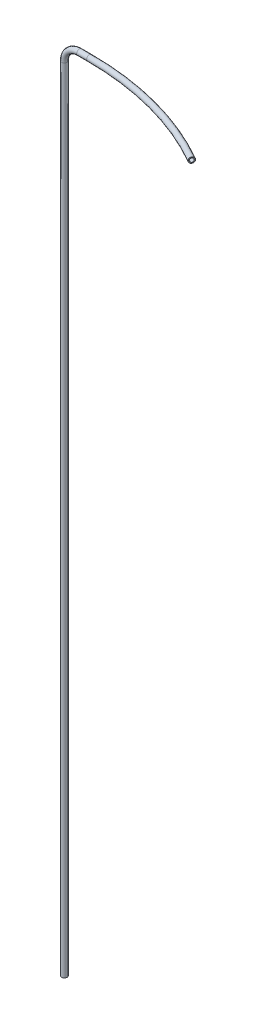
ISO-10303-21;
HEADER;
FILE_DESCRIPTION(('STEP AP214'),'2;1');
FILE_NAME('part.step','',(''),(''),'','','');
FILE_SCHEMA(('AUTOMOTIVE_DESIGN { 1 0 10303 214 1 1 1 1 }'));
ENDSEC;
DATA;
#1=APPLICATION_CONTEXT('core data for automotive mechanical design processes');
#2=APPLICATION_PROTOCOL_DEFINITION('international standard','automotive_design',2000,#1);
#3=PRODUCT_CONTEXT('',#1,'mechanical');
#4=PRODUCT('Part','Part','',(#3));
#5=PRODUCT_RELATED_PRODUCT_CATEGORY('part','',(#4));
#6=PRODUCT_DEFINITION_FORMATION('','',#4);
#7=PRODUCT_DEFINITION_CONTEXT('part definition',#1,'design');
#8=PRODUCT_DEFINITION('design','',#6,#7);
#9=PRODUCT_DEFINITION_SHAPE('','',#8);
#10=(LENGTH_UNIT() NAMED_UNIT(*) SI_UNIT(.MILLI.,.METRE.));
#11=(NAMED_UNIT(*) PLANE_ANGLE_UNIT() SI_UNIT($,.RADIAN.));
#12=(NAMED_UNIT(*) SI_UNIT($,.STERADIAN.) SOLID_ANGLE_UNIT());
#13=UNCERTAINTY_MEASURE_WITH_UNIT(LENGTH_MEASURE(1.E-05),#10,'distance_accuracy_value','');
#14=(GEOMETRIC_REPRESENTATION_CONTEXT(3) GLOBAL_UNCERTAINTY_ASSIGNED_CONTEXT((#13)) GLOBAL_UNIT_ASSIGNED_CONTEXT((#10,
#11,#12)) REPRESENTATION_CONTEXT('',''));
#15=CARTESIAN_POINT('',(0.,0.,0.));
#16=DIRECTION('',(0.,0.,1.));
#17=DIRECTION('',(1.,0.,0.));
#18=AXIS2_PLACEMENT_3D('',#15,#16,#17);
#19=CARTESIAN_POINT('',(0.,-0.371055821718923,-700.));
#20=DIRECTION('',(0.,1.,0.));
#21=DIRECTION('',(0.,0.,1.));
#22=AXIS2_PLACEMENT_3D('',#19,#20,#21);
#23=TOROIDAL_SURFACE('',#22,600.,6.0000000000001);
#24=CARTESIAN_POINT('',(300.000000000001,-0.371055821718923,-1219.61524227066));
#25=DIRECTION('',(0.866025403784438,0.,0.500000000000001));
#26=DIRECTION('',(0.500000000000001,0.,-0.866025403784438));
#27=AXIS2_PLACEMENT_3D('',#24,#25,#26);
#28=CIRCLE('',#27,6.0000000000001);
#29=CARTESIAN_POINT('',(303.000000000001,-0.371055821718923,-1224.81139469337));
#30=VERTEX_POINT('',#29);
#31=EDGE_CURVE('E49',#30,#30,#28,.T.);
#32=CARTESIAN_POINT('',(0.,-0.371055821718923,-1300.));
#33=DIRECTION('',(-1.,0.,0.));
#34=DIRECTION('',(0.,0.,1.));
#35=AXIS2_PLACEMENT_3D('',#32,#33,#34);
#36=CIRCLE('',#35,6.0000000000001);
#37=CARTESIAN_POINT('',(0.,-0.371055821718923,-1306.));
#38=VERTEX_POINT('',#37);
#39=EDGE_CURVE('E66',#38,#38,#36,.T.);
#40=CARTESIAN_POINT('',(0.,-0.371055821718923,-700.));
#41=DIRECTION('',(0.,1.,0.));
#42=DIRECTION('',(0.,0.,1.));
#43=AXIS2_PLACEMENT_3D('',#40,#41,#42);
#44=CIRCLE('',#43,606.);
#45=EDGE_CURVE('',#30,#38,#44,.T.);
#46=ORIENTED_EDGE('',*,*,#31,.F.);
#47=ORIENTED_EDGE('',*,*,#39,.F.);
#48=ORIENTED_EDGE('',*,*,#45,.T.);
#49=ORIENTED_EDGE('',*,*,#45,.F.);
#50=EDGE_LOOP('',(#46,#48,#47,#49));
#51=FACE_BOUND('',#50,.T.);
#52=ADVANCED_FACE('F41',(#51),#23,.T.);
#53=CARTESIAN_POINT('',(0.,-0.371055821718923,-700.));
#54=DIRECTION('',(0.,1.,0.));
#55=DIRECTION('',(0.,0.,1.));
#56=AXIS2_PLACEMENT_3D('',#53,#54,#55);
#57=TOROIDAL_SURFACE('',#56,600.,3.99999999999999);
#58=CARTESIAN_POINT('',(300.000000000001,-0.371055821718923,-1219.61524227066));
#59=DIRECTION('',(0.866025403784438,0.,0.500000000000001));
#60=DIRECTION('',(0.500000000000001,0.,-0.866025403784438));
#61=AXIS2_PLACEMENT_3D('',#58,#59,#60);
#62=CIRCLE('',#61,3.99999999999999);
#63=CARTESIAN_POINT('',(302.000000000001,-0.371055821718923,-1223.0793438858));
#64=VERTEX_POINT('',#63);
#65=EDGE_CURVE('E10',#64,#64,#62,.T.);
#66=CARTESIAN_POINT('',(0.,-0.371055821718923,-1300.));
#67=DIRECTION('',(1.,0.,0.));
#68=DIRECTION('',(0.,0.,-1.));
#69=AXIS2_PLACEMENT_3D('',#66,#67,#68);
#70=CIRCLE('',#69,3.99999999999999);
#71=CARTESIAN_POINT('',(0.,-0.371055821718923,-1304.));
#72=VERTEX_POINT('',#71);
#73=EDGE_CURVE('E54',#72,#72,#70,.T.);
#74=CARTESIAN_POINT('',(0.,-0.371055821718923,-700.));
#75=DIRECTION('',(0.,1.,0.));
#76=DIRECTION('',(0.,0.,1.));
#77=AXIS2_PLACEMENT_3D('',#74,#75,#76);
#78=CIRCLE('',#77,604.);
#79=EDGE_CURVE('',#64,#72,#78,.T.);
#80=ORIENTED_EDGE('',*,*,#65,.T.);
#81=ORIENTED_EDGE('',*,*,#73,.F.);
#82=ORIENTED_EDGE('',*,*,#79,.T.);
#83=ORIENTED_EDGE('',*,*,#79,.F.);
#84=EDGE_LOOP('',(#80,#82,#81,#83));
#85=FACE_BOUND('',#84,.T.);
#86=ADVANCED_FACE('F43',(#85),#57,.F.);
#87=CARTESIAN_POINT('',(-350.000000000001,0.,-93.7822173508934));
#88=DIRECTION('',(0.866025403784438,0.,0.500000000000001));
#89=DIRECTION('',(0.500000000000001,0.,-0.866025403784438));
#90=AXIS2_PLACEMENT_3D('',#87,#88,#89);
#91=PLANE('',#90);
#92=ORIENTED_EDGE('',*,*,#31,.T.);
#93=EDGE_LOOP('',(#92));
#94=FACE_BOUND('',#93,.T.);
#95=ORIENTED_EDGE('',*,*,#65,.F.);
#96=EDGE_LOOP('',(#95));
#97=FACE_BOUND('',#96,.T.);
#98=ADVANCED_FACE('F103',(#94,#97),#91,.T.);
#99=CARTESIAN_POINT('',(0.,-0.371055821718923,-1300.));
#100=DIRECTION('',(-1.,0.,0.));
#101=DIRECTION('',(0.,0.,1.));
#102=AXIS2_PLACEMENT_3D('',#99,#100,#101);
#103=CYLINDRICAL_SURFACE('',#102,6.0000000000001);
#104=CARTESIAN_POINT('',(-21.3411325230505,-0.371055821718923,-1300.));
#105=DIRECTION('',(-1.,0.,0.));
#106=DIRECTION('',(0.,0.,1.));
#107=AXIS2_PLACEMENT_3D('',#104,#105,#106);
#108=CIRCLE('',#107,6.0000000000001);
#109=CARTESIAN_POINT('',(-21.3411325230505,5.62894417828116,-1300.));
#110=VERTEX_POINT('',#109);
#111=EDGE_CURVE('E67',#110,#110,#108,.T.);
#112=ORIENTED_EDGE('',*,*,#111,.F.);
#113=EDGE_LOOP('',(#112));
#114=FACE_BOUND('',#113,.T.);
#115=ORIENTED_EDGE('',*,*,#39,.T.);
#116=EDGE_LOOP('',(#115));
#117=FACE_BOUND('',#116,.T.);
#118=ADVANCED_FACE('F96',(#114,#117),#103,.T.);
#119=CARTESIAN_POINT('',(-21.3411325230505,-32.7422911892462,-1300.));
#120=DIRECTION('',(0.,0.,1.));
#121=DIRECTION('',(1.,0.,0.));
#122=AXIS2_PLACEMENT_3D('',#119,#120,#121);
#123=TOROIDAL_SURFACE('',#122,32.3712353675273,6.0000000000001);
#124=CARTESIAN_POINT('',(-53.7123678905778,-32.7422911892462,-1300.));
#125=DIRECTION('',(0.,-1.,0.));
#126=DIRECTION('',(0.,0.,1.));
#127=AXIS2_PLACEMENT_3D('',#124,#125,#126);
#128=CIRCLE('',#127,6.0000000000001);
#129=CARTESIAN_POINT('',(-59.7123678905779,-32.7422911892462,-1300.));
#130=VERTEX_POINT('',#129);
#131=EDGE_CURVE('E62',#130,#130,#128,.T.);
#132=CARTESIAN_POINT('',(-21.3411325230505,-32.7422911892462,-1300.));
#133=DIRECTION('',(0.,0.,1.));
#134=DIRECTION('',(1.,0.,0.));
#135=AXIS2_PLACEMENT_3D('',#132,#133,#134);
#136=CIRCLE('',#135,38.3712353675274);
#137=EDGE_CURVE('',#110,#130,#136,.T.);
#138=ORIENTED_EDGE('',*,*,#111,.T.);
#139=ORIENTED_EDGE('',*,*,#131,.F.);
#140=ORIENTED_EDGE('',*,*,#137,.T.);
#141=ORIENTED_EDGE('',*,*,#137,.F.);
#142=EDGE_LOOP('',(#138,#140,#139,#141));
#143=FACE_BOUND('',#142,.T.);
#144=ADVANCED_FACE('F106',(#143),#123,.T.);
#145=CARTESIAN_POINT('',(-53.7123678905778,-32.7422911892462,-1300.));
#146=DIRECTION('',(0.,-1.,0.));
#147=DIRECTION('',(1.,0.,0.));
#148=AXIS2_PLACEMENT_3D('',#145,#146,#147);
#149=CYLINDRICAL_SURFACE('',#148,6.0000000000001);
#150=ORIENTED_EDGE('',*,*,#131,.T.);
#151=EDGE_LOOP('',(#150));
#152=FACE_BOUND('',#151,.T.);
#153=CARTESIAN_POINT('',(-53.712367890578,-1732.74229118925,-1300.));
#154=DIRECTION('',(0.,-1.,0.));
#155=DIRECTION('',(1.,0.,0.));
#156=AXIS2_PLACEMENT_3D('',#153,#154,#155);
#157=CIRCLE('',#156,6.00000000000001);
#158=CARTESIAN_POINT('',(-47.712367890578,-1732.74229118925,-1300.));
#159=VERTEX_POINT('',#158);
#160=EDGE_CURVE('E71',#159,#159,#157,.T.);
#161=ORIENTED_EDGE('',*,*,#160,.F.);
#162=EDGE_LOOP('',(#161));
#163=FACE_BOUND('',#162,.T.);
#164=ADVANCED_FACE('F118',(#152,#163),#149,.T.);
#165=CARTESIAN_POINT('',(0.,-0.371055821718923,-1300.));
#166=DIRECTION('',(-1.,0.,0.));
#167=DIRECTION('',(0.,0.,1.));
#168=AXIS2_PLACEMENT_3D('',#165,#166,#167);
#169=CYLINDRICAL_SURFACE('',#168,3.99999999999999);
#170=CARTESIAN_POINT('',(-21.3411325230505,-0.371055821718923,-1300.));
#171=DIRECTION('',(-1.,0.,0.));
#172=DIRECTION('',(0.,0.,1.));
#173=AXIS2_PLACEMENT_3D('',#170,#171,#172);
#174=CIRCLE('',#173,3.99999999999999);
#175=CARTESIAN_POINT('',(-21.3411325230505,3.62894417828106,-1300.));
#176=VERTEX_POINT('',#175);
#177=EDGE_CURVE('E75',#176,#176,#174,.F.);
#178=ORIENTED_EDGE('',*,*,#177,.F.);
#179=EDGE_LOOP('',(#178));
#180=FACE_BOUND('',#179,.T.);
#181=ORIENTED_EDGE('',*,*,#73,.T.);
#182=EDGE_LOOP('',(#181));
#183=FACE_BOUND('',#182,.T.);
#184=ADVANCED_FACE('F121',(#180,#183),#169,.F.);
#185=CARTESIAN_POINT('',(-21.3411325230505,-32.7422911892462,-1300.));
#186=DIRECTION('',(0.,0.,1.));
#187=DIRECTION('',(1.,0.,0.));
#188=AXIS2_PLACEMENT_3D('',#185,#186,#187);
#189=TOROIDAL_SURFACE('',#188,32.3712353675273,3.99999999999999);
#190=CARTESIAN_POINT('',(-53.7123678905778,-32.7422911892462,-1300.));
#191=DIRECTION('',(0.,-1.,0.));
#192=DIRECTION('',(0.,0.,1.));
#193=AXIS2_PLACEMENT_3D('',#190,#191,#192);
#194=CIRCLE('',#193,3.99999999999999);
#195=CARTESIAN_POINT('',(-57.7123678905778,-32.7422911892462,-1300.));
#196=VERTEX_POINT('',#195);
#197=EDGE_CURVE('E59',#196,#196,#194,.F.);
#198=CARTESIAN_POINT('',(-21.3411325230505,-32.7422911892462,-1300.));
#199=DIRECTION('',(0.,0.,1.));
#200=DIRECTION('',(1.,0.,0.));
#201=AXIS2_PLACEMENT_3D('',#198,#199,#200);
#202=CIRCLE('',#201,36.3712353675273);
#203=EDGE_CURVE('',#176,#196,#202,.T.);
#204=ORIENTED_EDGE('',*,*,#177,.T.);
#205=ORIENTED_EDGE('',*,*,#197,.F.);
#206=ORIENTED_EDGE('',*,*,#203,.T.);
#207=ORIENTED_EDGE('',*,*,#203,.F.);
#208=EDGE_LOOP('',(#204,#206,#205,#207));
#209=FACE_BOUND('',#208,.T.);
#210=ADVANCED_FACE('F100',(#209),#189,.F.);
#211=CARTESIAN_POINT('',(-53.7123678905778,-32.7422911892462,-1300.));
#212=DIRECTION('',(0.,-1.,0.));
#213=DIRECTION('',(1.,0.,0.));
#214=AXIS2_PLACEMENT_3D('',#211,#212,#213);
#215=CYLINDRICAL_SURFACE('',#214,3.99999999999999);
#216=ORIENTED_EDGE('',*,*,#197,.T.);
#217=EDGE_LOOP('',(#216));
#218=FACE_BOUND('',#217,.T.);
#219=CARTESIAN_POINT('',(-53.712367890578,-1732.74229118925,-1300.));
#220=DIRECTION('',(0.,-1.,0.));
#221=DIRECTION('',(1.,0.,0.));
#222=AXIS2_PLACEMENT_3D('',#219,#220,#221);
#223=CIRCLE('',#222,4.00000000000001);
#224=CARTESIAN_POINT('',(-49.712367890578,-1732.74229118925,-1300.));
#225=VERTEX_POINT('',#224);
#226=EDGE_CURVE('E85',#225,#225,#223,.T.);
#227=ORIENTED_EDGE('',*,*,#226,.T.);
#228=EDGE_LOOP('',(#227));
#229=FACE_BOUND('',#228,.T.);
#230=ADVANCED_FACE('F90',(#218,#229),#215,.F.);
#231=CARTESIAN_POINT('',(-53.712367890578,-1732.74229118925,-1300.));
#232=DIRECTION('',(0.,-1.,0.));
#233=DIRECTION('',(1.,0.,0.));
#234=AXIS2_PLACEMENT_3D('',#231,#232,#233);
#235=PLANE('',#234);
#236=ORIENTED_EDGE('',*,*,#160,.T.);
#237=EDGE_LOOP('',(#236));
#238=FACE_BOUND('',#237,.T.);
#239=ORIENTED_EDGE('',*,*,#226,.F.);
#240=EDGE_LOOP('',(#239));
#241=FACE_BOUND('',#240,.T.);
#242=ADVANCED_FACE('F92',(#238,#241),#235,.T.);
#243=CLOSED_SHELL('',(#52,#86,#98,#118,#144,#164,#184,#210,#230,#242));
#244=MANIFOLD_SOLID_BREP('B2',#243);
#245=ADVANCED_BREP_SHAPE_REPRESENTATION('',(#18,#244),#14);
#246=SHAPE_DEFINITION_REPRESENTATION(#9,#245);
ENDSEC;
END-ISO-10303-21;
